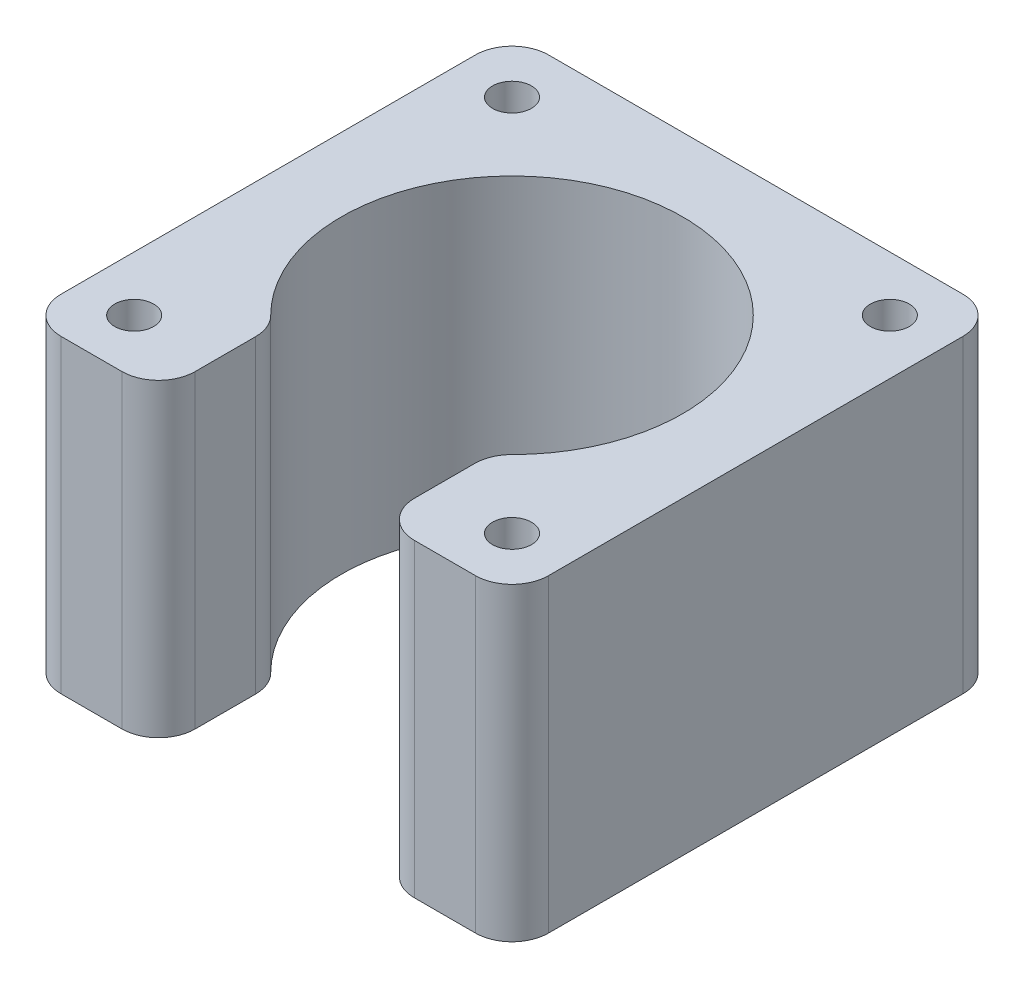
ISO-10303-21;
HEADER;
FILE_DESCRIPTION(('STEP AP214'),'2;1');
FILE_NAME('part.step','',(''),(''),'','','');
FILE_SCHEMA(('AUTOMOTIVE_DESIGN { 1 0 10303 214 1 1 1 1 }'));
ENDSEC;
DATA;
#1=APPLICATION_CONTEXT('core data for automotive mechanical design processes');
#2=APPLICATION_PROTOCOL_DEFINITION('international standard','automotive_design',2000,#1);
#3=PRODUCT_CONTEXT('',#1,'mechanical');
#4=PRODUCT('Part','Part','',(#3));
#5=PRODUCT_RELATED_PRODUCT_CATEGORY('part','',(#4));
#6=PRODUCT_DEFINITION_FORMATION('','',#4);
#7=PRODUCT_DEFINITION_CONTEXT('part definition',#1,'design');
#8=PRODUCT_DEFINITION('design','',#6,#7);
#9=PRODUCT_DEFINITION_SHAPE('','',#8);
#10=(LENGTH_UNIT() NAMED_UNIT(*) SI_UNIT(.MILLI.,.METRE.));
#11=(NAMED_UNIT(*) PLANE_ANGLE_UNIT() SI_UNIT($,.RADIAN.));
#12=(NAMED_UNIT(*) SI_UNIT($,.STERADIAN.) SOLID_ANGLE_UNIT());
#13=UNCERTAINTY_MEASURE_WITH_UNIT(LENGTH_MEASURE(1.E-05),#10,'distance_accuracy_value','');
#14=(GEOMETRIC_REPRESENTATION_CONTEXT(3) GLOBAL_UNCERTAINTY_ASSIGNED_CONTEXT((#13)) GLOBAL_UNIT_ASSIGNED_CONTEXT((#10,
#11,#12)) REPRESENTATION_CONTEXT('',''));
#15=CARTESIAN_POINT('',(0.,0.,0.));
#16=DIRECTION('',(0.,0.,1.));
#17=DIRECTION('',(1.,0.,0.));
#18=AXIS2_PLACEMENT_3D('',#15,#16,#17);
#19=CARTESIAN_POINT('',(0.,-25.4,0.));
#20=DIRECTION('',(0.,1.,0.));
#21=DIRECTION('',(0.,0.,1.));
#22=AXIS2_PLACEMENT_3D('',#19,#20,#21);
#23=CYLINDRICAL_SURFACE('',#22,14.);
#24=CARTESIAN_POINT('',(0.,-25.4,0.));
#25=DIRECTION('',(0.,1.,0.));
#26=DIRECTION('',(0.,0.,1.));
#27=AXIS2_PLACEMENT_3D('',#24,#25,#26);
#28=CIRCLE('',#27,14.);
#29=CARTESIAN_POINT('',(9.88235294117647,-25.4,9.91660730018189));
#30=VERTEX_POINT('',#29);
#31=CARTESIAN_POINT('',(-9.88235294117647,-25.4,9.91660730018189));
#32=VERTEX_POINT('',#31);
#33=EDGE_CURVE('E324',#30,#32,#28,.T.);
#34=ORIENTED_EDGE('',*,*,#33,.F.);
#35=DIRECTION('',(0.,1.,0.));
#36=VECTOR('',#35,1.);
#37=CARTESIAN_POINT('',(9.88235294117647,-25.4,9.91660730018189));
#38=LINE('',#37,#36);
#39=CARTESIAN_POINT('',(9.88235294117647,0.,9.91660730018189));
#40=VERTEX_POINT('',#39);
#41=EDGE_CURVE('E259',#30,#40,#38,.T.);
#42=ORIENTED_EDGE('',*,*,#41,.T.);
#43=CARTESIAN_POINT('',(0.,0.,0.));
#44=DIRECTION('',(0.,1.,0.));
#45=DIRECTION('',(0.,0.,1.));
#46=AXIS2_PLACEMENT_3D('',#43,#44,#45);
#47=CIRCLE('',#46,14.);
#48=CARTESIAN_POINT('',(-9.88235294117647,0.,9.91660730018189));
#49=VERTEX_POINT('',#48);
#50=EDGE_CURVE('E313',#40,#49,#47,.T.);
#51=ORIENTED_EDGE('',*,*,#50,.T.);
#52=DIRECTION('',(0.,1.,0.));
#53=VECTOR('',#52,1.);
#54=CARTESIAN_POINT('',(-9.88235294117647,-25.4,9.91660730018189));
#55=LINE('',#54,#53);
#56=EDGE_CURVE('E256',#49,#32,#55,.F.);
#57=ORIENTED_EDGE('',*,*,#56,.T.);
#58=EDGE_LOOP('',(#34,#42,#51,#57));
#59=FACE_BOUND('',#58,.T.);
#60=ADVANCED_FACE('F41',(#59),#23,.F.);
#61=CARTESIAN_POINT('',(-8.99999999999999,-25.4,0.));
#62=DIRECTION('',(1.,0.,0.));
#63=DIRECTION('',(0.,0.,-1.));
#64=AXIS2_PLACEMENT_3D('',#61,#62,#63);
#65=PLANE('',#64);
#66=DIRECTION('',(0.,0.,-1.));
#67=VECTOR('',#66,1.);
#68=CARTESIAN_POINT('',(-8.99999999999999,0.,0.));
#69=LINE('',#68,#67);
#70=CARTESIAN_POINT('',(-9.,0.,17.));
#71=VERTEX_POINT('',#70);
#72=CARTESIAN_POINT('',(-9.,0.,12.0415945787923));
#73=VERTEX_POINT('',#72);
#74=EDGE_CURVE('E179',#71,#73,#69,.T.);
#75=ORIENTED_EDGE('',*,*,#74,.F.);
#76=DIRECTION('',(0.,1.,0.));
#77=VECTOR('',#76,1.);
#78=CARTESIAN_POINT('',(-9.,-25.4,17.));
#79=LINE('',#78,#77);
#80=CARTESIAN_POINT('',(-9.,-25.4,17.));
#81=VERTEX_POINT('',#80);
#82=EDGE_CURVE('E218',#71,#81,#79,.F.);
#83=ORIENTED_EDGE('',*,*,#82,.T.);
#84=DIRECTION('',(0.,0.,-1.));
#85=VECTOR('',#84,1.);
#86=CARTESIAN_POINT('',(-8.99999999999999,-25.4,0.));
#87=LINE('',#86,#85);
#88=CARTESIAN_POINT('',(-9.,-25.4,12.0415945787923));
#89=VERTEX_POINT('',#88);
#90=EDGE_CURVE('E184',#81,#89,#87,.T.);
#91=ORIENTED_EDGE('',*,*,#90,.T.);
#92=DIRECTION('',(0.,-1.,0.));
#93=VECTOR('',#92,1.);
#94=CARTESIAN_POINT('',(-9.,0.,12.0415945787923));
#95=LINE('',#94,#93);
#96=EDGE_CURVE('E214',#89,#73,#95,.F.);
#97=ORIENTED_EDGE('',*,*,#96,.T.);
#98=EDGE_LOOP('',(#75,#83,#91,#97));
#99=FACE_BOUND('',#98,.T.);
#100=ADVANCED_FACE('F406',(#99),#65,.T.);
#101=CARTESIAN_POINT('',(0.,-25.4,20.));
#102=DIRECTION('',(0.,0.,1.));
#103=DIRECTION('',(1.,0.,0.));
#104=AXIS2_PLACEMENT_3D('',#101,#102,#103);
#105=PLANE('',#104);
#106=DIRECTION('',(1.,0.,0.));
#107=VECTOR('',#106,1.);
#108=CARTESIAN_POINT('',(0.,-25.4,20.));
#109=LINE('',#108,#107);
#110=CARTESIAN_POINT('',(-17.,-25.4,20.));
#111=VERTEX_POINT('',#110);
#112=CARTESIAN_POINT('',(-12.,-25.4,20.));
#113=VERTEX_POINT('',#112);
#114=EDGE_CURVE('E190',#111,#113,#109,.T.);
#115=ORIENTED_EDGE('',*,*,#114,.T.);
#116=DIRECTION('',(0.,1.,0.));
#117=VECTOR('',#116,1.);
#118=CARTESIAN_POINT('',(-12.,-25.4,20.));
#119=LINE('',#118,#117);
#120=CARTESIAN_POINT('',(-12.,0.,20.));
#121=VERTEX_POINT('',#120);
#122=EDGE_CURVE('E169',#113,#121,#119,.T.);
#123=ORIENTED_EDGE('',*,*,#122,.T.);
#124=DIRECTION('',(1.,0.,0.));
#125=VECTOR('',#124,1.);
#126=CARTESIAN_POINT('',(0.,0.,20.));
#127=LINE('',#126,#125);
#128=CARTESIAN_POINT('',(-17.,0.,20.));
#129=VERTEX_POINT('',#128);
#130=EDGE_CURVE('E160',#129,#121,#127,.T.);
#131=ORIENTED_EDGE('',*,*,#130,.F.);
#132=DIRECTION('',(0.,1.,0.));
#133=VECTOR('',#132,1.);
#134=CARTESIAN_POINT('',(-17.,-25.4,20.));
#135=LINE('',#134,#133);
#136=EDGE_CURVE('E175',#129,#111,#135,.F.);
#137=ORIENTED_EDGE('',*,*,#136,.T.);
#138=EDGE_LOOP('',(#115,#123,#131,#137));
#139=FACE_BOUND('',#138,.T.);
#140=ADVANCED_FACE('F174',(#139),#105,.T.);
#141=CARTESIAN_POINT('',(-20.,-25.4,0.));
#142=DIRECTION('',(-1.,0.,0.));
#143=DIRECTION('',(0.,0.,1.));
#144=AXIS2_PLACEMENT_3D('',#141,#142,#143);
#145=PLANE('',#144);
#146=DIRECTION('',(0.,0.,1.));
#147=VECTOR('',#146,1.);
#148=CARTESIAN_POINT('',(-20.,0.,0.));
#149=LINE('',#148,#147);
#150=CARTESIAN_POINT('',(-20.,0.,-17.));
#151=VERTEX_POINT('',#150);
#152=CARTESIAN_POINT('',(-20.,0.,17.));
#153=VERTEX_POINT('',#152);
#154=EDGE_CURVE('E162',#151,#153,#149,.T.);
#155=ORIENTED_EDGE('',*,*,#154,.F.);
#156=DIRECTION('',(0.,1.,0.));
#157=VECTOR('',#156,1.);
#158=CARTESIAN_POINT('',(-20.,-25.4,-17.));
#159=LINE('',#158,#157);
#160=CARTESIAN_POINT('',(-20.,-25.4,-17.));
#161=VERTEX_POINT('',#160);
#162=EDGE_CURVE('E273',#151,#161,#159,.F.);
#163=ORIENTED_EDGE('',*,*,#162,.T.);
#164=DIRECTION('',(0.,0.,1.));
#165=VECTOR('',#164,1.);
#166=CARTESIAN_POINT('',(-20.,-25.4,0.));
#167=LINE('',#166,#165);
#168=CARTESIAN_POINT('',(-20.,-25.4,17.));
#169=VERTEX_POINT('',#168);
#170=EDGE_CURVE('E335',#161,#169,#167,.T.);
#171=ORIENTED_EDGE('',*,*,#170,.T.);
#172=DIRECTION('',(0.,1.,0.));
#173=VECTOR('',#172,1.);
#174=CARTESIAN_POINT('',(-20.,-25.4,17.));
#175=LINE('',#174,#173);
#176=EDGE_CURVE('E270',#169,#153,#175,.T.);
#177=ORIENTED_EDGE('',*,*,#176,.T.);
#178=EDGE_LOOP('',(#155,#163,#171,#177));
#179=FACE_BOUND('',#178,.T.);
#180=ADVANCED_FACE('F536',(#179),#145,.T.);
#181=CARTESIAN_POINT('',(0.,-25.4,-20.));
#182=DIRECTION('',(0.,0.,-1.));
#183=DIRECTION('',(-1.,0.,0.));
#184=AXIS2_PLACEMENT_3D('',#181,#182,#183);
#185=PLANE('',#184);
#186=DIRECTION('',(-1.,0.,0.));
#187=VECTOR('',#186,1.);
#188=CARTESIAN_POINT('',(0.,-25.4,-20.));
#189=LINE('',#188,#187);
#190=CARTESIAN_POINT('',(17.,-25.4,-20.));
#191=VERTEX_POINT('',#190);
#192=CARTESIAN_POINT('',(-17.,-25.4,-20.));
#193=VERTEX_POINT('',#192);
#194=EDGE_CURVE('E294',#191,#193,#189,.T.);
#195=ORIENTED_EDGE('',*,*,#194,.T.);
#196=DIRECTION('',(0.,1.,0.));
#197=VECTOR('',#196,1.);
#198=CARTESIAN_POINT('',(-17.,-25.4,-20.));
#199=LINE('',#198,#197);
#200=CARTESIAN_POINT('',(-17.,0.,-20.));
#201=VERTEX_POINT('',#200);
#202=EDGE_CURVE('E266',#193,#201,#199,.T.);
#203=ORIENTED_EDGE('',*,*,#202,.T.);
#204=DIRECTION('',(-1.,0.,0.));
#205=VECTOR('',#204,1.);
#206=CARTESIAN_POINT('',(0.,0.,-20.));
#207=LINE('',#206,#205);
#208=CARTESIAN_POINT('',(17.,0.,-20.));
#209=VERTEX_POINT('',#208);
#210=EDGE_CURVE('E311',#209,#201,#207,.T.);
#211=ORIENTED_EDGE('',*,*,#210,.F.);
#212=DIRECTION('',(0.,1.,0.));
#213=VECTOR('',#212,1.);
#214=CARTESIAN_POINT('',(17.,-25.4,-20.));
#215=LINE('',#214,#213);
#216=EDGE_CURVE('E263',#209,#191,#215,.F.);
#217=ORIENTED_EDGE('',*,*,#216,.T.);
#218=EDGE_LOOP('',(#195,#203,#211,#217));
#219=FACE_BOUND('',#218,.T.);
#220=ADVANCED_FACE('F527',(#219),#185,.T.);
#221=CARTESIAN_POINT('',(20.,-25.4,0.));
#222=DIRECTION('',(1.,0.,0.));
#223=DIRECTION('',(0.,0.,-1.));
#224=AXIS2_PLACEMENT_3D('',#221,#222,#223);
#225=PLANE('',#224);
#226=DIRECTION('',(0.,0.,-1.));
#227=VECTOR('',#226,1.);
#228=CARTESIAN_POINT('',(20.,-25.4,0.));
#229=LINE('',#228,#227);
#230=CARTESIAN_POINT('',(20.,-25.4,17.));
#231=VERTEX_POINT('',#230);
#232=CARTESIAN_POINT('',(20.,-25.4,-17.));
#233=VERTEX_POINT('',#232);
#234=EDGE_CURVE('E282',#231,#233,#229,.T.);
#235=ORIENTED_EDGE('',*,*,#234,.T.);
#236=DIRECTION('',(0.,1.,0.));
#237=VECTOR('',#236,1.);
#238=CARTESIAN_POINT('',(20.,-25.4,-17.));
#239=LINE('',#238,#237);
#240=CARTESIAN_POINT('',(20.,0.,-17.));
#241=VERTEX_POINT('',#240);
#242=EDGE_CURVE('E11',#233,#241,#239,.T.);
#243=ORIENTED_EDGE('',*,*,#242,.T.);
#244=DIRECTION('',(0.,0.,-1.));
#245=VECTOR('',#244,1.);
#246=CARTESIAN_POINT('',(20.,0.,0.));
#247=LINE('',#246,#245);
#248=CARTESIAN_POINT('',(20.,0.,17.));
#249=VERTEX_POINT('',#248);
#250=EDGE_CURVE('E285',#249,#241,#247,.T.);
#251=ORIENTED_EDGE('',*,*,#250,.F.);
#252=DIRECTION('',(0.,1.,0.));
#253=VECTOR('',#252,1.);
#254=CARTESIAN_POINT('',(20.,-25.4,17.));
#255=LINE('',#254,#253);
#256=EDGE_CURVE('E50',#249,#231,#255,.F.);
#257=ORIENTED_EDGE('',*,*,#256,.T.);
#258=EDGE_LOOP('',(#235,#243,#251,#257));
#259=FACE_BOUND('',#258,.T.);
#260=ADVANCED_FACE('F281',(#259),#225,.T.);
#261=CARTESIAN_POINT('',(0.,-25.4,20.));
#262=DIRECTION('',(0.,0.,1.));
#263=DIRECTION('',(1.,0.,0.));
#264=AXIS2_PLACEMENT_3D('',#261,#262,#263);
#265=PLANE('',#264);
#266=DIRECTION('',(1.,0.,0.));
#267=VECTOR('',#266,1.);
#268=CARTESIAN_POINT('',(0.,0.,20.));
#269=LINE('',#268,#267);
#270=CARTESIAN_POINT('',(12.,0.,20.));
#271=VERTEX_POINT('',#270);
#272=CARTESIAN_POINT('',(17.,0.,20.));
#273=VERTEX_POINT('',#272);
#274=EDGE_CURVE('E303',#271,#273,#269,.T.);
#275=ORIENTED_EDGE('',*,*,#274,.F.);
#276=DIRECTION('',(0.,1.,0.));
#277=VECTOR('',#276,1.);
#278=CARTESIAN_POINT('',(12.,-25.4,20.));
#279=LINE('',#278,#277);
#280=CARTESIAN_POINT('',(12.,-25.4,20.));
#281=VERTEX_POINT('',#280);
#282=EDGE_CURVE('E253',#271,#281,#279,.F.);
#283=ORIENTED_EDGE('',*,*,#282,.T.);
#284=DIRECTION('',(1.,0.,0.));
#285=VECTOR('',#284,1.);
#286=CARTESIAN_POINT('',(0.,-25.4,20.));
#287=LINE('',#286,#285);
#288=CARTESIAN_POINT('',(17.,-25.4,20.));
#289=VERTEX_POINT('',#288);
#290=EDGE_CURVE('E295',#281,#289,#287,.T.);
#291=ORIENTED_EDGE('',*,*,#290,.T.);
#292=DIRECTION('',(0.,1.,0.));
#293=VECTOR('',#292,1.);
#294=CARTESIAN_POINT('',(17.,-25.4,20.));
#295=LINE('',#294,#293);
#296=EDGE_CURVE('E249',#289,#273,#295,.T.);
#297=ORIENTED_EDGE('',*,*,#296,.T.);
#298=EDGE_LOOP('',(#275,#283,#291,#297));
#299=FACE_BOUND('',#298,.T.);
#300=ADVANCED_FACE('F302',(#299),#265,.T.);
#301=CARTESIAN_POINT('',(8.99999999999999,-25.4,0.));
#302=DIRECTION('',(-1.,0.,0.));
#303=DIRECTION('',(0.,0.,1.));
#304=AXIS2_PLACEMENT_3D('',#301,#302,#303);
#305=PLANE('',#304);
#306=DIRECTION('',(0.,0.,1.));
#307=VECTOR('',#306,1.);
#308=CARTESIAN_POINT('',(8.99999999999999,-25.4,0.));
#309=LINE('',#308,#307);
#310=CARTESIAN_POINT('',(9.,-25.4,12.0415945787923));
#311=VERTEX_POINT('',#310);
#312=CARTESIAN_POINT('',(9.,-25.4,17.));
#313=VERTEX_POINT('',#312);
#314=EDGE_CURVE('E327',#311,#313,#309,.T.);
#315=ORIENTED_EDGE('',*,*,#314,.T.);
#316=DIRECTION('',(0.,1.,0.));
#317=VECTOR('',#316,1.);
#318=CARTESIAN_POINT('',(9.,-25.4,17.));
#319=LINE('',#318,#317);
#320=CARTESIAN_POINT('',(9.,0.,17.));
#321=VERTEX_POINT('',#320);
#322=EDGE_CURVE('E245',#313,#321,#319,.T.);
#323=ORIENTED_EDGE('',*,*,#322,.T.);
#324=DIRECTION('',(0.,0.,1.));
#325=VECTOR('',#324,1.);
#326=CARTESIAN_POINT('',(8.99999999999999,0.,0.));
#327=LINE('',#326,#325);
#328=CARTESIAN_POINT('',(9.,0.,12.0415945787923));
#329=VERTEX_POINT('',#328);
#330=EDGE_CURVE('E307',#329,#321,#327,.T.);
#331=ORIENTED_EDGE('',*,*,#330,.F.);
#332=DIRECTION('',(0.,-1.,0.));
#333=VECTOR('',#332,1.);
#334=CARTESIAN_POINT('',(9.,-25.4,12.0415945787923));
#335=LINE('',#334,#333);
#336=EDGE_CURVE('E64',#329,#311,#335,.T.);
#337=ORIENTED_EDGE('',*,*,#336,.T.);
#338=EDGE_LOOP('',(#315,#323,#331,#337));
#339=FACE_BOUND('',#338,.T.);
#340=ADVANCED_FACE('F416',(#339),#305,.T.);
#341=CARTESIAN_POINT('',(0.,-25.4,0.));
#342=DIRECTION('',(0.,1.,0.));
#343=DIRECTION('',(0.,0.,1.));
#344=AXIS2_PLACEMENT_3D('',#341,#342,#343);
#345=PLANE('',#344);
#346=CARTESIAN_POINT('',(-15.5,-25.4,-15.5));
#347=DIRECTION('',(0.,1.,0.));
#348=DIRECTION('',(0.,0.,1.));
#349=AXIS2_PLACEMENT_3D('',#346,#347,#348);
#350=CIRCLE('',#349,1.59999999999999);
#351=CARTESIAN_POINT('',(-15.5,-25.4,-13.9));
#352=VERTEX_POINT('',#351);
#353=EDGE_CURVE('E373',#352,#352,#350,.T.);
#354=ORIENTED_EDGE('',*,*,#353,.T.);
#355=EDGE_LOOP('',(#354));
#356=FACE_BOUND('',#355,.T.);
#357=CARTESIAN_POINT('',(15.5,-25.4,-15.5));
#358=DIRECTION('',(0.,1.,0.));
#359=DIRECTION('',(0.,0.,1.));
#360=AXIS2_PLACEMENT_3D('',#357,#358,#359);
#361=CIRCLE('',#360,1.59999999999999);
#362=CARTESIAN_POINT('',(15.5,-25.4,-13.9));
#363=VERTEX_POINT('',#362);
#364=EDGE_CURVE('E365',#363,#363,#361,.T.);
#365=ORIENTED_EDGE('',*,*,#364,.T.);
#366=EDGE_LOOP('',(#365));
#367=FACE_BOUND('',#366,.T.);
#368=CARTESIAN_POINT('',(15.5,-25.4,15.5));
#369=DIRECTION('',(0.,1.,0.));
#370=DIRECTION('',(0.,0.,1.));
#371=AXIS2_PLACEMENT_3D('',#368,#369,#370);
#372=CIRCLE('',#371,1.6);
#373=CARTESIAN_POINT('',(15.5,-25.4,17.1));
#374=VERTEX_POINT('',#373);
#375=EDGE_CURVE('E355',#374,#374,#372,.T.);
#376=ORIENTED_EDGE('',*,*,#375,.T.);
#377=EDGE_LOOP('',(#376));
#378=FACE_BOUND('',#377,.T.);
#379=CARTESIAN_POINT('',(-15.5,-25.4,15.5));
#380=DIRECTION('',(0.,1.,0.));
#381=DIRECTION('',(0.,0.,1.));
#382=AXIS2_PLACEMENT_3D('',#379,#380,#381);
#383=CIRCLE('',#382,1.59999999999999);
#384=CARTESIAN_POINT('',(-15.5,-25.4,17.1));
#385=VERTEX_POINT('',#384);
#386=EDGE_CURVE('E343',#385,#385,#383,.T.);
#387=ORIENTED_EDGE('',*,*,#386,.T.);
#388=EDGE_LOOP('',(#387));
#389=FACE_BOUND('',#388,.T.);
#390=ORIENTED_EDGE('',*,*,#90,.F.);
#391=CARTESIAN_POINT('',(-12.,-25.4,17.));
#392=DIRECTION('',(0.,1.,0.));
#393=DIRECTION('',(0.,0.,1.));
#394=AXIS2_PLACEMENT_3D('',#391,#392,#393);
#395=CIRCLE('',#394,3.);
#396=EDGE_CURVE('E240',#81,#113,#395,.F.);
#397=ORIENTED_EDGE('',*,*,#396,.T.);
#398=ORIENTED_EDGE('',*,*,#114,.F.);
#399=CARTESIAN_POINT('',(-17.,-25.4,17.));
#400=DIRECTION('',(0.,1.,0.));
#401=DIRECTION('',(0.,0.,1.));
#402=AXIS2_PLACEMENT_3D('',#399,#400,#401);
#403=CIRCLE('',#402,3.);
#404=EDGE_CURVE('E182',#111,#169,#403,.F.);
#405=ORIENTED_EDGE('',*,*,#404,.T.);
#406=ORIENTED_EDGE('',*,*,#170,.F.);
#407=CARTESIAN_POINT('',(-17.,-25.4,-17.));
#408=DIRECTION('',(0.,1.,0.));
#409=DIRECTION('',(0.,0.,1.));
#410=AXIS2_PLACEMENT_3D('',#407,#408,#409);
#411=CIRCLE('',#410,3.);
#412=EDGE_CURVE('E229',#161,#193,#411,.F.);
#413=ORIENTED_EDGE('',*,*,#412,.T.);
#414=ORIENTED_EDGE('',*,*,#194,.F.);
#415=CARTESIAN_POINT('',(17.,-25.4,-17.));
#416=DIRECTION('',(0.,1.,0.));
#417=DIRECTION('',(0.,0.,1.));
#418=AXIS2_PLACEMENT_3D('',#415,#416,#417);
#419=CIRCLE('',#418,3.);
#420=EDGE_CURVE('E226',#191,#233,#419,.F.);
#421=ORIENTED_EDGE('',*,*,#420,.T.);
#422=ORIENTED_EDGE('',*,*,#234,.F.);
#423=CARTESIAN_POINT('',(17.,-25.4,17.));
#424=DIRECTION('',(0.,1.,0.));
#425=DIRECTION('',(0.,0.,1.));
#426=AXIS2_PLACEMENT_3D('',#423,#424,#425);
#427=CIRCLE('',#426,3.);
#428=EDGE_CURVE('E223',#231,#289,#427,.F.);
#429=ORIENTED_EDGE('',*,*,#428,.T.);
#430=ORIENTED_EDGE('',*,*,#290,.F.);
#431=CARTESIAN_POINT('',(12.,-25.4,17.));
#432=DIRECTION('',(0.,1.,0.));
#433=DIRECTION('',(0.,0.,1.));
#434=AXIS2_PLACEMENT_3D('',#431,#432,#433);
#435=CIRCLE('',#434,3.);
#436=EDGE_CURVE('E57',#281,#313,#435,.F.);
#437=ORIENTED_EDGE('',*,*,#436,.T.);
#438=ORIENTED_EDGE('',*,*,#314,.F.);
#439=CARTESIAN_POINT('',(12.,-25.4,12.0415945787923));
#440=DIRECTION('',(0.,1.,0.));
#441=DIRECTION('',(0.,0.,1.));
#442=AXIS2_PLACEMENT_3D('',#439,#440,#441);
#443=CIRCLE('',#442,3.);
#444=EDGE_CURVE('E235',#311,#30,#443,.F.);
#445=ORIENTED_EDGE('',*,*,#444,.T.);
#446=ORIENTED_EDGE('',*,*,#33,.T.);
#447=CARTESIAN_POINT('',(-12.,-25.4,12.0415945787923));
#448=DIRECTION('',(0.,1.,0.));
#449=DIRECTION('',(0.,0.,1.));
#450=AXIS2_PLACEMENT_3D('',#447,#448,#449);
#451=CIRCLE('',#450,3.);
#452=EDGE_CURVE('E232',#32,#89,#451,.F.);
#453=ORIENTED_EDGE('',*,*,#452,.T.);
#454=EDGE_LOOP('',(#390,#397,#398,#405,#406,#413,#414,#421,#422,#429,#430,#437,#438,#445,#446,#453));
#455=FACE_BOUND('',#454,.T.);
#456=ADVANCED_FACE('F289',(#356,#367,#378,#389,#455),#345,.F.);
#457=CARTESIAN_POINT('',(0.,0.,0.));
#458=DIRECTION('',(0.,1.,0.));
#459=DIRECTION('',(0.,0.,1.));
#460=AXIS2_PLACEMENT_3D('',#457,#458,#459);
#461=PLANE('',#460);
#462=CARTESIAN_POINT('',(-15.5,0.,-15.5));
#463=DIRECTION('',(0.,1.,0.));
#464=DIRECTION('',(0.,0.,1.));
#465=AXIS2_PLACEMENT_3D('',#462,#463,#464);
#466=CIRCLE('',#465,1.6);
#467=CARTESIAN_POINT('',(-15.5,0.,-13.9));
#468=VERTEX_POINT('',#467);
#469=EDGE_CURVE('E377',#468,#468,#466,.T.);
#470=ORIENTED_EDGE('',*,*,#469,.F.);
#471=EDGE_LOOP('',(#470));
#472=FACE_BOUND('',#471,.T.);
#473=CARTESIAN_POINT('',(15.5,0.,-15.5));
#474=DIRECTION('',(0.,1.,0.));
#475=DIRECTION('',(0.,0.,1.));
#476=AXIS2_PLACEMENT_3D('',#473,#474,#475);
#477=CIRCLE('',#476,1.6);
#478=CARTESIAN_POINT('',(15.5,0.,-13.9));
#479=VERTEX_POINT('',#478);
#480=EDGE_CURVE('E369',#479,#479,#477,.T.);
#481=ORIENTED_EDGE('',*,*,#480,.F.);
#482=EDGE_LOOP('',(#481));
#483=FACE_BOUND('',#482,.T.);
#484=CARTESIAN_POINT('',(15.5,0.,15.5));
#485=DIRECTION('',(0.,1.,0.));
#486=DIRECTION('',(0.,0.,1.));
#487=AXIS2_PLACEMENT_3D('',#484,#485,#486);
#488=CIRCLE('',#487,1.6);
#489=CARTESIAN_POINT('',(15.5,0.,17.1));
#490=VERTEX_POINT('',#489);
#491=EDGE_CURVE('E361',#490,#490,#488,.T.);
#492=ORIENTED_EDGE('',*,*,#491,.F.);
#493=EDGE_LOOP('',(#492));
#494=FACE_BOUND('',#493,.T.);
#495=CARTESIAN_POINT('',(-15.5,0.,15.5));
#496=DIRECTION('',(0.,1.,0.));
#497=DIRECTION('',(0.,0.,1.));
#498=AXIS2_PLACEMENT_3D('',#495,#496,#497);
#499=CIRCLE('',#498,1.6);
#500=CARTESIAN_POINT('',(-15.5,0.,17.1));
#501=VERTEX_POINT('',#500);
#502=EDGE_CURVE('E349',#501,#501,#499,.T.);
#503=ORIENTED_EDGE('',*,*,#502,.F.);
#504=EDGE_LOOP('',(#503));
#505=FACE_BOUND('',#504,.T.);
#506=ORIENTED_EDGE('',*,*,#130,.T.);
#507=CARTESIAN_POINT('',(-12.,0.,17.));
#508=DIRECTION('',(0.,1.,0.));
#509=DIRECTION('',(0.,0.,1.));
#510=AXIS2_PLACEMENT_3D('',#507,#508,#509);
#511=CIRCLE('',#510,3.);
#512=EDGE_CURVE('E211',#121,#71,#511,.T.);
#513=ORIENTED_EDGE('',*,*,#512,.T.);
#514=ORIENTED_EDGE('',*,*,#74,.T.);
#515=CARTESIAN_POINT('',(-12.,0.,12.0415945787923));
#516=DIRECTION('',(0.,1.,0.));
#517=DIRECTION('',(0.,0.,1.));
#518=AXIS2_PLACEMENT_3D('',#515,#516,#517);
#519=CIRCLE('',#518,3.);
#520=EDGE_CURVE('E202',#73,#49,#519,.T.);
#521=ORIENTED_EDGE('',*,*,#520,.T.);
#522=ORIENTED_EDGE('',*,*,#50,.F.);
#523=CARTESIAN_POINT('',(12.,0.,12.0415945787923));
#524=DIRECTION('',(0.,1.,0.));
#525=DIRECTION('',(0.,0.,1.));
#526=AXIS2_PLACEMENT_3D('',#523,#524,#525);
#527=CIRCLE('',#526,3.);
#528=EDGE_CURVE('E205',#40,#329,#527,.T.);
#529=ORIENTED_EDGE('',*,*,#528,.T.);
#530=ORIENTED_EDGE('',*,*,#330,.T.);
#531=CARTESIAN_POINT('',(12.,0.,17.));
#532=DIRECTION('',(0.,1.,0.));
#533=DIRECTION('',(0.,0.,1.));
#534=AXIS2_PLACEMENT_3D('',#531,#532,#533);
#535=CIRCLE('',#534,3.);
#536=EDGE_CURVE('E208',#321,#271,#535,.T.);
#537=ORIENTED_EDGE('',*,*,#536,.T.);
#538=ORIENTED_EDGE('',*,*,#274,.T.);
#539=CARTESIAN_POINT('',(17.,0.,17.));
#540=DIRECTION('',(0.,1.,0.));
#541=DIRECTION('',(0.,0.,1.));
#542=AXIS2_PLACEMENT_3D('',#539,#540,#541);
#543=CIRCLE('',#542,3.);
#544=EDGE_CURVE('E168',#273,#249,#543,.T.);
#545=ORIENTED_EDGE('',*,*,#544,.T.);
#546=ORIENTED_EDGE('',*,*,#250,.T.);
#547=CARTESIAN_POINT('',(17.,0.,-17.));
#548=DIRECTION('',(0.,1.,0.));
#549=DIRECTION('',(0.,0.,1.));
#550=AXIS2_PLACEMENT_3D('',#547,#548,#549);
#551=CIRCLE('',#550,3.);
#552=EDGE_CURVE('E196',#241,#209,#551,.T.);
#553=ORIENTED_EDGE('',*,*,#552,.T.);
#554=ORIENTED_EDGE('',*,*,#210,.T.);
#555=CARTESIAN_POINT('',(-17.,0.,-17.));
#556=DIRECTION('',(0.,1.,0.));
#557=DIRECTION('',(0.,0.,1.));
#558=AXIS2_PLACEMENT_3D('',#555,#556,#557);
#559=CIRCLE('',#558,3.);
#560=EDGE_CURVE('E199',#201,#151,#559,.T.);
#561=ORIENTED_EDGE('',*,*,#560,.T.);
#562=ORIENTED_EDGE('',*,*,#154,.T.);
#563=CARTESIAN_POINT('',(-17.,0.,17.));
#564=DIRECTION('',(0.,1.,0.));
#565=DIRECTION('',(0.,0.,1.));
#566=AXIS2_PLACEMENT_3D('',#563,#564,#565);
#567=CIRCLE('',#566,3.);
#568=EDGE_CURVE('E157',#153,#129,#567,.T.);
#569=ORIENTED_EDGE('',*,*,#568,.T.);
#570=EDGE_LOOP('',(#506,#513,#514,#521,#522,#529,#530,#537,#538,#545,#546,#553,#554,#561,#562,#569));
#571=FACE_BOUND('',#570,.T.);
#572=ADVANCED_FACE('F159',(#472,#483,#494,#505,#571),#461,.T.);
#573=CARTESIAN_POINT('',(-15.5,0.,15.5));
#574=DIRECTION('',(0.,1.,0.));
#575=DIRECTION('',(0.,0.,1.));
#576=AXIS2_PLACEMENT_3D('',#573,#574,#575);
#577=CYLINDRICAL_SURFACE('',#576,1.6);
#578=ORIENTED_EDGE('',*,*,#386,.F.);
#579=EDGE_LOOP('',(#578));
#580=FACE_BOUND('',#579,.T.);
#581=ORIENTED_EDGE('',*,*,#502,.T.);
#582=EDGE_LOOP('',(#581));
#583=FACE_BOUND('',#582,.T.);
#584=ADVANCED_FACE('F386',(#580,#583),#577,.F.);
#585=CARTESIAN_POINT('',(15.5,0.,15.5));
#586=DIRECTION('',(0.,1.,0.));
#587=DIRECTION('',(0.,0.,1.));
#588=AXIS2_PLACEMENT_3D('',#585,#586,#587);
#589=CYLINDRICAL_SURFACE('',#588,1.6);
#590=ORIENTED_EDGE('',*,*,#375,.F.);
#591=EDGE_LOOP('',(#590));
#592=FACE_BOUND('',#591,.T.);
#593=ORIENTED_EDGE('',*,*,#491,.T.);
#594=EDGE_LOOP('',(#593));
#595=FACE_BOUND('',#594,.T.);
#596=ADVANCED_FACE('F395',(#592,#595),#589,.F.);
#597=CARTESIAN_POINT('',(15.5,0.,-15.5));
#598=DIRECTION('',(0.,1.,0.));
#599=DIRECTION('',(0.,0.,1.));
#600=AXIS2_PLACEMENT_3D('',#597,#598,#599);
#601=CYLINDRICAL_SURFACE('',#600,1.59999999999999);
#602=ORIENTED_EDGE('',*,*,#364,.F.);
#603=EDGE_LOOP('',(#602));
#604=FACE_BOUND('',#603,.T.);
#605=ORIENTED_EDGE('',*,*,#480,.T.);
#606=EDGE_LOOP('',(#605));
#607=FACE_BOUND('',#606,.T.);
#608=ADVANCED_FACE('F401',(#604,#607),#601,.F.);
#609=CARTESIAN_POINT('',(-15.5,0.,-15.5));
#610=DIRECTION('',(0.,1.,0.));
#611=DIRECTION('',(0.,0.,1.));
#612=AXIS2_PLACEMENT_3D('',#609,#610,#611);
#613=CYLINDRICAL_SURFACE('',#612,1.6);
#614=ORIENTED_EDGE('',*,*,#353,.F.);
#615=EDGE_LOOP('',(#614));
#616=FACE_BOUND('',#615,.T.);
#617=ORIENTED_EDGE('',*,*,#469,.T.);
#618=EDGE_LOOP('',(#617));
#619=FACE_BOUND('',#618,.T.);
#620=ADVANCED_FACE('F382',(#616,#619),#613,.F.);
#621=CARTESIAN_POINT('',(-12.,-25.4,17.));
#622=DIRECTION('',(0.,1.,0.));
#623=DIRECTION('',(0.,0.,1.));
#624=AXIS2_PLACEMENT_3D('',#621,#622,#623);
#625=CYLINDRICAL_SURFACE('',#624,3.);
#626=ORIENTED_EDGE('',*,*,#396,.F.);
#627=ORIENTED_EDGE('',*,*,#82,.F.);
#628=ORIENTED_EDGE('',*,*,#512,.F.);
#629=ORIENTED_EDGE('',*,*,#122,.F.);
#630=EDGE_LOOP('',(#626,#627,#628,#629));
#631=FACE_BOUND('',#630,.T.);
#632=ADVANCED_FACE('F418',(#631),#625,.T.);
#633=CARTESIAN_POINT('',(12.,-25.4,17.));
#634=DIRECTION('',(0.,1.,0.));
#635=DIRECTION('',(0.,0.,1.));
#636=AXIS2_PLACEMENT_3D('',#633,#634,#635);
#637=CYLINDRICAL_SURFACE('',#636,3.);
#638=ORIENTED_EDGE('',*,*,#436,.F.);
#639=ORIENTED_EDGE('',*,*,#282,.F.);
#640=ORIENTED_EDGE('',*,*,#536,.F.);
#641=ORIENTED_EDGE('',*,*,#322,.F.);
#642=EDGE_LOOP('',(#638,#639,#640,#641));
#643=FACE_BOUND('',#642,.T.);
#644=ADVANCED_FACE('F421',(#643),#637,.T.);
#645=CARTESIAN_POINT('',(12.,-25.4,12.0415945787923));
#646=DIRECTION('',(0.,1.,0.));
#647=DIRECTION('',(0.,0.,1.));
#648=AXIS2_PLACEMENT_3D('',#645,#646,#647);
#649=CYLINDRICAL_SURFACE('',#648,3.);
#650=ORIENTED_EDGE('',*,*,#444,.F.);
#651=ORIENTED_EDGE('',*,*,#336,.F.);
#652=ORIENTED_EDGE('',*,*,#528,.F.);
#653=ORIENTED_EDGE('',*,*,#41,.F.);
#654=EDGE_LOOP('',(#650,#651,#652,#653));
#655=FACE_BOUND('',#654,.T.);
#656=ADVANCED_FACE('F425',(#655),#649,.T.);
#657=CARTESIAN_POINT('',(-12.,-25.4,12.0415945787923));
#658=DIRECTION('',(0.,1.,0.));
#659=DIRECTION('',(0.,0.,1.));
#660=AXIS2_PLACEMENT_3D('',#657,#658,#659);
#661=CYLINDRICAL_SURFACE('',#660,3.);
#662=ORIENTED_EDGE('',*,*,#452,.F.);
#663=ORIENTED_EDGE('',*,*,#56,.F.);
#664=ORIENTED_EDGE('',*,*,#520,.F.);
#665=ORIENTED_EDGE('',*,*,#96,.F.);
#666=EDGE_LOOP('',(#662,#663,#664,#665));
#667=FACE_BOUND('',#666,.T.);
#668=ADVANCED_FACE('F429',(#667),#661,.T.);
#669=CARTESIAN_POINT('',(-17.,-25.4,-17.));
#670=DIRECTION('',(0.,1.,0.));
#671=DIRECTION('',(0.,0.,1.));
#672=AXIS2_PLACEMENT_3D('',#669,#670,#671);
#673=CYLINDRICAL_SURFACE('',#672,3.);
#674=ORIENTED_EDGE('',*,*,#412,.F.);
#675=ORIENTED_EDGE('',*,*,#162,.F.);
#676=ORIENTED_EDGE('',*,*,#560,.F.);
#677=ORIENTED_EDGE('',*,*,#202,.F.);
#678=EDGE_LOOP('',(#674,#675,#676,#677));
#679=FACE_BOUND('',#678,.T.);
#680=ADVANCED_FACE('F433',(#679),#673,.T.);
#681=CARTESIAN_POINT('',(17.,-25.4,-17.));
#682=DIRECTION('',(0.,1.,0.));
#683=DIRECTION('',(0.,0.,1.));
#684=AXIS2_PLACEMENT_3D('',#681,#682,#683);
#685=CYLINDRICAL_SURFACE('',#684,3.);
#686=ORIENTED_EDGE('',*,*,#420,.F.);
#687=ORIENTED_EDGE('',*,*,#216,.F.);
#688=ORIENTED_EDGE('',*,*,#552,.F.);
#689=ORIENTED_EDGE('',*,*,#242,.F.);
#690=EDGE_LOOP('',(#686,#687,#688,#689));
#691=FACE_BOUND('',#690,.T.);
#692=ADVANCED_FACE('F437',(#691),#685,.T.);
#693=CARTESIAN_POINT('',(17.,-25.4,17.));
#694=DIRECTION('',(0.,1.,0.));
#695=DIRECTION('',(0.,0.,1.));
#696=AXIS2_PLACEMENT_3D('',#693,#694,#695);
#697=CYLINDRICAL_SURFACE('',#696,3.);
#698=ORIENTED_EDGE('',*,*,#428,.F.);
#699=ORIENTED_EDGE('',*,*,#256,.F.);
#700=ORIENTED_EDGE('',*,*,#544,.F.);
#701=ORIENTED_EDGE('',*,*,#296,.F.);
#702=EDGE_LOOP('',(#698,#699,#700,#701));
#703=FACE_BOUND('',#702,.T.);
#704=ADVANCED_FACE('F298',(#703),#697,.T.);
#705=CARTESIAN_POINT('',(-17.,-25.4,17.));
#706=DIRECTION('',(0.,1.,0.));
#707=DIRECTION('',(0.,0.,1.));
#708=AXIS2_PLACEMENT_3D('',#705,#706,#707);
#709=CYLINDRICAL_SURFACE('',#708,3.);
#710=ORIENTED_EDGE('',*,*,#404,.F.);
#711=ORIENTED_EDGE('',*,*,#136,.F.);
#712=ORIENTED_EDGE('',*,*,#568,.F.);
#713=ORIENTED_EDGE('',*,*,#176,.F.);
#714=EDGE_LOOP('',(#710,#711,#712,#713));
#715=FACE_BOUND('',#714,.T.);
#716=ADVANCED_FACE('F43',(#715),#709,.T.);
#717=CLOSED_SHELL('',(#60,#100,#140,#180,#220,#260,#300,#340,#456,#572,#584,#596,#608,#620,#632,
#644,#656,#668,#680,#692,#704,#716));
#718=MANIFOLD_SOLID_BREP('B2',#717);
#719=ADVANCED_BREP_SHAPE_REPRESENTATION('',(#18,#718),#14);
#720=SHAPE_DEFINITION_REPRESENTATION(#9,#719);
ENDSEC;
END-ISO-10303-21;
